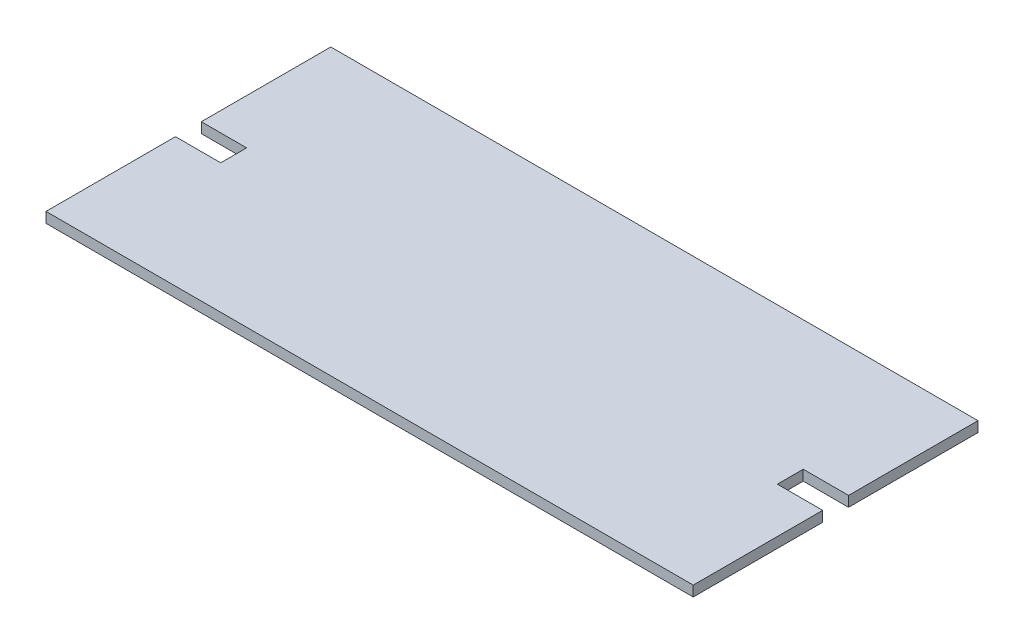
ISO-10303-21;
HEADER;
FILE_DESCRIPTION(('STEP AP214'),'2;1');
FILE_NAME('part.step','',(''),(''),'','','');
FILE_SCHEMA(('AUTOMOTIVE_DESIGN { 1 0 10303 214 1 1 1 1 }'));
ENDSEC;
DATA;
#1=APPLICATION_CONTEXT('core data for automotive mechanical design processes');
#2=APPLICATION_PROTOCOL_DEFINITION('international standard','automotive_design',2000,#1);
#3=PRODUCT_CONTEXT('',#1,'mechanical');
#4=PRODUCT('Part','Part','',(#3));
#5=PRODUCT_RELATED_PRODUCT_CATEGORY('part','',(#4));
#6=PRODUCT_DEFINITION_FORMATION('','',#4);
#7=PRODUCT_DEFINITION_CONTEXT('part definition',#1,'design');
#8=PRODUCT_DEFINITION('design','',#6,#7);
#9=PRODUCT_DEFINITION_SHAPE('','',#8);
#10=(LENGTH_UNIT() NAMED_UNIT(*) SI_UNIT(.MILLI.,.METRE.));
#11=(NAMED_UNIT(*) PLANE_ANGLE_UNIT() SI_UNIT($,.RADIAN.));
#12=(NAMED_UNIT(*) SI_UNIT($,.STERADIAN.) SOLID_ANGLE_UNIT());
#13=UNCERTAINTY_MEASURE_WITH_UNIT(LENGTH_MEASURE(1.E-05),#10,'distance_accuracy_value','');
#14=(GEOMETRIC_REPRESENTATION_CONTEXT(3) GLOBAL_UNCERTAINTY_ASSIGNED_CONTEXT((#13)) GLOBAL_UNIT_ASSIGNED_CONTEXT((#10,
#11,#12)) REPRESENTATION_CONTEXT('',''));
#15=CARTESIAN_POINT('',(0.,0.,0.));
#16=DIRECTION('',(0.,0.,1.));
#17=DIRECTION('',(1.,0.,0.));
#18=AXIS2_PLACEMENT_3D('',#15,#16,#17);
#19=CARTESIAN_POINT('',(43.,1.6,0.));
#20=DIRECTION('',(1.,0.,0.));
#21=DIRECTION('',(0.,0.,-1.));
#22=AXIS2_PLACEMENT_3D('',#19,#20,#21);
#23=PLANE('',#22);
#24=DIRECTION('',(0.,0.,1.));
#25=VECTOR('',#24,1.);
#26=CARTESIAN_POINT('',(43.,0.,0.));
#27=LINE('',#26,#25);
#28=CARTESIAN_POINT('',(43.,0.,-2.));
#29=VERTEX_POINT('',#28);
#30=CARTESIAN_POINT('',(43.,0.,2.));
#31=VERTEX_POINT('',#30);
#32=EDGE_CURVE('E202',#29,#31,#27,.T.);
#33=ORIENTED_EDGE('',*,*,#32,.F.);
#34=DIRECTION('',(0.,-1.,0.));
#35=VECTOR('',#34,1.);
#36=CARTESIAN_POINT('',(43.,1.6,-2.));
#37=LINE('',#36,#35);
#38=CARTESIAN_POINT('',(43.,1.6,-2.));
#39=VERTEX_POINT('',#38);
#40=EDGE_CURVE('E11',#39,#29,#37,.T.);
#41=ORIENTED_EDGE('',*,*,#40,.F.);
#42=DIRECTION('',(0.,0.,1.));
#43=VECTOR('',#42,1.);
#44=CARTESIAN_POINT('',(43.,1.6,0.));
#45=LINE('',#44,#43);
#46=CARTESIAN_POINT('',(43.,1.6,2.));
#47=VERTEX_POINT('',#46);
#48=EDGE_CURVE('E164',#39,#47,#45,.T.);
#49=ORIENTED_EDGE('',*,*,#48,.T.);
#50=DIRECTION('',(0.,-1.,0.));
#51=VECTOR('',#50,1.);
#52=CARTESIAN_POINT('',(43.,1.6,2.));
#53=LINE('',#52,#51);
#54=EDGE_CURVE('E99',#47,#31,#53,.T.);
#55=ORIENTED_EDGE('',*,*,#54,.T.);
#56=EDGE_LOOP('',(#33,#41,#49,#55));
#57=FACE_BOUND('',#56,.T.);
#58=ADVANCED_FACE('F37',(#57),#23,.T.);
#59=CARTESIAN_POINT('',(0.,1.6,-2.00000000000001));
#60=DIRECTION('',(0.,0.,1.));
#61=DIRECTION('',(1.,0.,0.));
#62=AXIS2_PLACEMENT_3D('',#59,#60,#61);
#63=PLANE('',#62);
#64=DIRECTION('',(-1.,0.,0.));
#65=VECTOR('',#64,1.);
#66=CARTESIAN_POINT('',(0.,0.,-2.00000000000001));
#67=LINE('',#66,#65);
#68=CARTESIAN_POINT('',(50.,0.,-2.));
#69=VERTEX_POINT('',#68);
#70=EDGE_CURVE('E199',#69,#29,#67,.T.);
#71=ORIENTED_EDGE('',*,*,#70,.F.);
#72=DIRECTION('',(0.,-1.,0.));
#73=VECTOR('',#72,1.);
#74=CARTESIAN_POINT('',(50.,1.6,-2.));
#75=LINE('',#74,#73);
#76=CARTESIAN_POINT('',(50.,1.6,-2.));
#77=VERTEX_POINT('',#76);
#78=EDGE_CURVE('E45',#77,#69,#75,.T.);
#79=ORIENTED_EDGE('',*,*,#78,.F.);
#80=DIRECTION('',(-1.,0.,0.));
#81=VECTOR('',#80,1.);
#82=CARTESIAN_POINT('',(0.,1.6,-2.00000000000001));
#83=LINE('',#82,#81);
#84=EDGE_CURVE('E158',#77,#39,#83,.T.);
#85=ORIENTED_EDGE('',*,*,#84,.T.);
#86=ORIENTED_EDGE('',*,*,#40,.T.);
#87=EDGE_LOOP('',(#71,#79,#85,#86));
#88=FACE_BOUND('',#87,.T.);
#89=ADVANCED_FACE('F200',(#88),#63,.T.);
#90=CARTESIAN_POINT('',(50.,1.6,0.));
#91=DIRECTION('',(1.,0.,0.));
#92=DIRECTION('',(0.,0.,-1.));
#93=AXIS2_PLACEMENT_3D('',#90,#91,#92);
#94=PLANE('',#93);
#95=DIRECTION('',(0.,0.,1.));
#96=VECTOR('',#95,1.);
#97=CARTESIAN_POINT('',(50.,0.,0.));
#98=LINE('',#97,#96);
#99=CARTESIAN_POINT('',(50.,0.,-22.));
#100=VERTEX_POINT('',#99);
#101=EDGE_CURVE('E173',#100,#69,#98,.T.);
#102=ORIENTED_EDGE('',*,*,#101,.F.);
#103=DIRECTION('',(0.,-1.,0.));
#104=VECTOR('',#103,1.);
#105=CARTESIAN_POINT('',(50.,1.6,-22.));
#106=LINE('',#105,#104);
#107=CARTESIAN_POINT('',(50.,1.6,-22.));
#108=VERTEX_POINT('',#107);
#109=EDGE_CURVE('E192',#108,#100,#106,.T.);
#110=ORIENTED_EDGE('',*,*,#109,.F.);
#111=DIRECTION('',(0.,0.,1.));
#112=VECTOR('',#111,1.);
#113=CARTESIAN_POINT('',(50.,1.6,0.));
#114=LINE('',#113,#112);
#115=EDGE_CURVE('E152',#108,#77,#114,.T.);
#116=ORIENTED_EDGE('',*,*,#115,.T.);
#117=ORIENTED_EDGE('',*,*,#78,.T.);
#118=EDGE_LOOP('',(#102,#110,#116,#117));
#119=FACE_BOUND('',#118,.T.);
#120=ADVANCED_FACE('F195',(#119),#94,.T.);
#121=CARTESIAN_POINT('',(0.,1.6,-22.));
#122=DIRECTION('',(0.,0.,-1.));
#123=DIRECTION('',(-1.,0.,0.));
#124=AXIS2_PLACEMENT_3D('',#121,#122,#123);
#125=PLANE('',#124);
#126=DIRECTION('',(1.,0.,0.));
#127=VECTOR('',#126,1.);
#128=CARTESIAN_POINT('',(0.,0.,-22.));
#129=LINE('',#128,#127);
#130=CARTESIAN_POINT('',(-50.,0.,-22.));
#131=VERTEX_POINT('',#130);
#132=EDGE_CURVE('E207',#131,#100,#129,.T.);
#133=ORIENTED_EDGE('',*,*,#132,.F.);
#134=DIRECTION('',(0.,-1.,0.));
#135=VECTOR('',#134,1.);
#136=CARTESIAN_POINT('',(-50.,1.6,-22.));
#137=LINE('',#136,#135);
#138=CARTESIAN_POINT('',(-50.,1.6,-22.));
#139=VERTEX_POINT('',#138);
#140=EDGE_CURVE('E190',#139,#131,#137,.T.);
#141=ORIENTED_EDGE('',*,*,#140,.F.);
#142=DIRECTION('',(1.,0.,0.));
#143=VECTOR('',#142,1.);
#144=CARTESIAN_POINT('',(0.,1.6,-22.));
#145=LINE('',#144,#143);
#146=EDGE_CURVE('E157',#139,#108,#145,.T.);
#147=ORIENTED_EDGE('',*,*,#146,.T.);
#148=ORIENTED_EDGE('',*,*,#109,.T.);
#149=EDGE_LOOP('',(#133,#141,#147,#148));
#150=FACE_BOUND('',#149,.T.);
#151=ADVANCED_FACE('F250',(#150),#125,.T.);
#152=CARTESIAN_POINT('',(-50.,1.6,0.));
#153=DIRECTION('',(1.,0.,0.));
#154=DIRECTION('',(0.,0.,-1.));
#155=AXIS2_PLACEMENT_3D('',#152,#153,#154);
#156=PLANE('',#155);
#157=DIRECTION('',(0.,0.,1.));
#158=VECTOR('',#157,1.);
#159=CARTESIAN_POINT('',(-50.,0.,0.));
#160=LINE('',#159,#158);
#161=CARTESIAN_POINT('',(-50.,0.,-2.));
#162=VERTEX_POINT('',#161);
#163=EDGE_CURVE('E208',#131,#162,#160,.T.);
#164=ORIENTED_EDGE('',*,*,#163,.T.);
#165=DIRECTION('',(0.,-1.,0.));
#166=VECTOR('',#165,1.);
#167=CARTESIAN_POINT('',(-50.,1.6,-2.));
#168=LINE('',#167,#166);
#169=CARTESIAN_POINT('',(-50.,1.6,-2.));
#170=VERTEX_POINT('',#169);
#171=EDGE_CURVE('E187',#170,#162,#168,.T.);
#172=ORIENTED_EDGE('',*,*,#171,.F.);
#173=DIRECTION('',(0.,0.,1.));
#174=VECTOR('',#173,1.);
#175=CARTESIAN_POINT('',(-50.,1.6,0.));
#176=LINE('',#175,#174);
#177=EDGE_CURVE('E162',#139,#170,#176,.T.);
#178=ORIENTED_EDGE('',*,*,#177,.F.);
#179=ORIENTED_EDGE('',*,*,#140,.T.);
#180=EDGE_LOOP('',(#164,#172,#178,#179));
#181=FACE_BOUND('',#180,.T.);
#182=ADVANCED_FACE('F239',(#181),#156,.F.);
#183=CARTESIAN_POINT('',(0.,1.6,-2.00000000000002));
#184=DIRECTION('',(0.,0.,-1.));
#185=DIRECTION('',(-1.,0.,0.));
#186=AXIS2_PLACEMENT_3D('',#183,#184,#185);
#187=PLANE('',#186);
#188=DIRECTION('',(1.,0.,0.));
#189=VECTOR('',#188,1.);
#190=CARTESIAN_POINT('',(0.,0.,-2.00000000000002));
#191=LINE('',#190,#189);
#192=CARTESIAN_POINT('',(-43.,0.,-2.));
#193=VERTEX_POINT('',#192);
#194=EDGE_CURVE('E213',#162,#193,#191,.T.);
#195=ORIENTED_EDGE('',*,*,#194,.T.);
#196=DIRECTION('',(0.,-1.,0.));
#197=VECTOR('',#196,1.);
#198=CARTESIAN_POINT('',(-43.,1.6,-2.));
#199=LINE('',#198,#197);
#200=CARTESIAN_POINT('',(-43.,1.6,-2.));
#201=VERTEX_POINT('',#200);
#202=EDGE_CURVE('E184',#201,#193,#199,.T.);
#203=ORIENTED_EDGE('',*,*,#202,.F.);
#204=DIRECTION('',(1.,0.,0.));
#205=VECTOR('',#204,1.);
#206=CARTESIAN_POINT('',(0.,1.6,-2.00000000000002));
#207=LINE('',#206,#205);
#208=EDGE_CURVE('E231',#170,#201,#207,.T.);
#209=ORIENTED_EDGE('',*,*,#208,.F.);
#210=ORIENTED_EDGE('',*,*,#171,.T.);
#211=EDGE_LOOP('',(#195,#203,#209,#210));
#212=FACE_BOUND('',#211,.T.);
#213=ADVANCED_FACE('F242',(#212),#187,.F.);
#214=CARTESIAN_POINT('',(-43.,1.6,0.));
#215=DIRECTION('',(1.,0.,0.));
#216=DIRECTION('',(0.,0.,-1.));
#217=AXIS2_PLACEMENT_3D('',#214,#215,#216);
#218=PLANE('',#217);
#219=DIRECTION('',(0.,0.,1.));
#220=VECTOR('',#219,1.);
#221=CARTESIAN_POINT('',(-43.,0.,0.));
#222=LINE('',#221,#220);
#223=CARTESIAN_POINT('',(-43.,0.,2.));
#224=VERTEX_POINT('',#223);
#225=EDGE_CURVE('E216',#193,#224,#222,.T.);
#226=ORIENTED_EDGE('',*,*,#225,.T.);
#227=DIRECTION('',(0.,-1.,0.));
#228=VECTOR('',#227,1.);
#229=CARTESIAN_POINT('',(-43.,1.6,2.));
#230=LINE('',#229,#228);
#231=CARTESIAN_POINT('',(-43.,1.6,2.));
#232=VERTEX_POINT('',#231);
#233=EDGE_CURVE('E182',#232,#224,#230,.T.);
#234=ORIENTED_EDGE('',*,*,#233,.F.);
#235=DIRECTION('',(0.,0.,1.));
#236=VECTOR('',#235,1.);
#237=CARTESIAN_POINT('',(-43.,1.6,0.));
#238=LINE('',#237,#236);
#239=EDGE_CURVE('E229',#201,#232,#238,.T.);
#240=ORIENTED_EDGE('',*,*,#239,.F.);
#241=ORIENTED_EDGE('',*,*,#202,.T.);
#242=EDGE_LOOP('',(#226,#234,#240,#241));
#243=FACE_BOUND('',#242,.T.);
#244=ADVANCED_FACE('F246',(#243),#218,.F.);
#245=CARTESIAN_POINT('',(0.,1.6,2.00000000000002));
#246=DIRECTION('',(0.,0.,-1.));
#247=DIRECTION('',(-1.,0.,0.));
#248=AXIS2_PLACEMENT_3D('',#245,#246,#247);
#249=PLANE('',#248);
#250=DIRECTION('',(1.,0.,0.));
#251=VECTOR('',#250,1.);
#252=CARTESIAN_POINT('',(0.,0.,2.00000000000002));
#253=LINE('',#252,#251);
#254=CARTESIAN_POINT('',(-50.,0.,2.));
#255=VERTEX_POINT('',#254);
#256=EDGE_CURVE('E218',#255,#224,#253,.T.);
#257=ORIENTED_EDGE('',*,*,#256,.F.);
#258=DIRECTION('',(0.,-1.,0.));
#259=VECTOR('',#258,1.);
#260=CARTESIAN_POINT('',(-50.,1.6,2.));
#261=LINE('',#260,#259);
#262=CARTESIAN_POINT('',(-50.,1.6,2.));
#263=VERTEX_POINT('',#262);
#264=EDGE_CURVE('E180',#263,#255,#261,.T.);
#265=ORIENTED_EDGE('',*,*,#264,.F.);
#266=DIRECTION('',(1.,0.,0.));
#267=VECTOR('',#266,1.);
#268=CARTESIAN_POINT('',(0.,1.6,2.00000000000002));
#269=LINE('',#268,#267);
#270=EDGE_CURVE('E226',#263,#232,#269,.T.);
#271=ORIENTED_EDGE('',*,*,#270,.T.);
#272=ORIENTED_EDGE('',*,*,#233,.T.);
#273=EDGE_LOOP('',(#257,#265,#271,#272));
#274=FACE_BOUND('',#273,.T.);
#275=ADVANCED_FACE('F248',(#274),#249,.T.);
#276=CARTESIAN_POINT('',(-50.,0.,22.));
#277=VERTEX_POINT('',#276);
#278=EDGE_CURVE('E214',#255,#277,#160,.T.);
#279=ORIENTED_EDGE('',*,*,#278,.T.);
#280=DIRECTION('',(0.,-1.,0.));
#281=VECTOR('',#280,1.);
#282=CARTESIAN_POINT('',(-50.,1.6,22.));
#283=LINE('',#282,#281);
#284=CARTESIAN_POINT('',(-50.,1.6,22.));
#285=VERTEX_POINT('',#284);
#286=EDGE_CURVE('E148',#285,#277,#283,.T.);
#287=ORIENTED_EDGE('',*,*,#286,.F.);
#288=EDGE_CURVE('E135',#263,#285,#176,.T.);
#289=ORIENTED_EDGE('',*,*,#288,.F.);
#290=ORIENTED_EDGE('',*,*,#264,.T.);
#291=EDGE_LOOP('',(#279,#287,#289,#290));
#292=FACE_BOUND('',#291,.T.);
#293=ADVANCED_FACE('F224',(#292),#156,.F.);
#294=CARTESIAN_POINT('',(0.,1.6,22.));
#295=DIRECTION('',(0.,0.,-1.));
#296=DIRECTION('',(-1.,0.,0.));
#297=AXIS2_PLACEMENT_3D('',#294,#295,#296);
#298=PLANE('',#297);
#299=DIRECTION('',(1.,0.,0.));
#300=VECTOR('',#299,1.);
#301=CARTESIAN_POINT('',(0.,0.,22.));
#302=LINE('',#301,#300);
#303=CARTESIAN_POINT('',(50.,0.,22.));
#304=VERTEX_POINT('',#303);
#305=EDGE_CURVE('E144',#277,#304,#302,.T.);
#306=ORIENTED_EDGE('',*,*,#305,.T.);
#307=DIRECTION('',(0.,-1.,0.));
#308=VECTOR('',#307,1.);
#309=CARTESIAN_POINT('',(50.,1.6,22.));
#310=LINE('',#309,#308);
#311=CARTESIAN_POINT('',(50.,1.6,22.));
#312=VERTEX_POINT('',#311);
#313=EDGE_CURVE('E141',#312,#304,#310,.T.);
#314=ORIENTED_EDGE('',*,*,#313,.F.);
#315=DIRECTION('',(1.,0.,0.));
#316=VECTOR('',#315,1.);
#317=CARTESIAN_POINT('',(0.,1.6,22.));
#318=LINE('',#317,#316);
#319=EDGE_CURVE('E128',#285,#312,#318,.T.);
#320=ORIENTED_EDGE('',*,*,#319,.F.);
#321=ORIENTED_EDGE('',*,*,#286,.T.);
#322=EDGE_LOOP('',(#306,#314,#320,#321));
#323=FACE_BOUND('',#322,.T.);
#324=ADVANCED_FACE('F142',(#323),#298,.F.);
#325=CARTESIAN_POINT('',(50.,0.,2.));
#326=VERTEX_POINT('',#325);
#327=EDGE_CURVE('E169',#326,#304,#98,.T.);
#328=ORIENTED_EDGE('',*,*,#327,.F.);
#329=DIRECTION('',(0.,-1.,0.));
#330=VECTOR('',#329,1.);
#331=CARTESIAN_POINT('',(50.,1.6,2.));
#332=LINE('',#331,#330);
#333=CARTESIAN_POINT('',(50.,1.6,2.));
#334=VERTEX_POINT('',#333);
#335=EDGE_CURVE('E92',#334,#326,#332,.T.);
#336=ORIENTED_EDGE('',*,*,#335,.F.);
#337=EDGE_CURVE('E132',#334,#312,#114,.T.);
#338=ORIENTED_EDGE('',*,*,#337,.T.);
#339=ORIENTED_EDGE('',*,*,#313,.T.);
#340=EDGE_LOOP('',(#328,#336,#338,#339));
#341=FACE_BOUND('',#340,.T.);
#342=ADVANCED_FACE('F150',(#341),#94,.T.);
#343=CARTESIAN_POINT('',(0.,1.6,2.00000000000001));
#344=DIRECTION('',(0.,0.,1.));
#345=DIRECTION('',(1.,0.,0.));
#346=AXIS2_PLACEMENT_3D('',#343,#344,#345);
#347=PLANE('',#346);
#348=DIRECTION('',(-1.,0.,0.));
#349=VECTOR('',#348,1.);
#350=CARTESIAN_POINT('',(0.,0.,2.00000000000001));
#351=LINE('',#350,#349);
#352=EDGE_CURVE('E167',#326,#31,#351,.T.);
#353=ORIENTED_EDGE('',*,*,#352,.T.);
#354=ORIENTED_EDGE('',*,*,#54,.F.);
#355=DIRECTION('',(-1.,0.,0.));
#356=VECTOR('',#355,1.);
#357=CARTESIAN_POINT('',(0.,1.6,2.00000000000001));
#358=LINE('',#357,#356);
#359=EDGE_CURVE('E53',#334,#47,#358,.T.);
#360=ORIENTED_EDGE('',*,*,#359,.F.);
#361=ORIENTED_EDGE('',*,*,#335,.T.);
#362=EDGE_LOOP('',(#353,#354,#360,#361));
#363=FACE_BOUND('',#362,.T.);
#364=ADVANCED_FACE('F327',(#363),#347,.F.);
#365=CARTESIAN_POINT('',(0.,1.6,0.));
#366=DIRECTION('',(0.,1.,0.));
#367=DIRECTION('',(0.,0.,1.));
#368=AXIS2_PLACEMENT_3D('',#365,#366,#367);
#369=PLANE('',#368);
#370=ORIENTED_EDGE('',*,*,#48,.F.);
#371=ORIENTED_EDGE('',*,*,#84,.F.);
#372=ORIENTED_EDGE('',*,*,#115,.F.);
#373=ORIENTED_EDGE('',*,*,#146,.F.);
#374=ORIENTED_EDGE('',*,*,#177,.T.);
#375=ORIENTED_EDGE('',*,*,#208,.T.);
#376=ORIENTED_EDGE('',*,*,#239,.T.);
#377=ORIENTED_EDGE('',*,*,#270,.F.);
#378=ORIENTED_EDGE('',*,*,#288,.T.);
#379=ORIENTED_EDGE('',*,*,#319,.T.);
#380=ORIENTED_EDGE('',*,*,#337,.F.);
#381=ORIENTED_EDGE('',*,*,#359,.T.);
#382=EDGE_LOOP('',(#370,#371,#372,#373,#374,#375,#376,#377,#378,#379,#380,#381));
#383=FACE_BOUND('',#382,.T.);
#384=ADVANCED_FACE('F130',(#383),#369,.T.);
#385=CARTESIAN_POINT('',(0.,0.,0.));
#386=DIRECTION('',(0.,1.,0.));
#387=DIRECTION('',(0.,0.,1.));
#388=AXIS2_PLACEMENT_3D('',#385,#386,#387);
#389=PLANE('',#388);
#390=ORIENTED_EDGE('',*,*,#32,.T.);
#391=ORIENTED_EDGE('',*,*,#352,.F.);
#392=ORIENTED_EDGE('',*,*,#327,.T.);
#393=ORIENTED_EDGE('',*,*,#305,.F.);
#394=ORIENTED_EDGE('',*,*,#278,.F.);
#395=ORIENTED_EDGE('',*,*,#256,.T.);
#396=ORIENTED_EDGE('',*,*,#225,.F.);
#397=ORIENTED_EDGE('',*,*,#194,.F.);
#398=ORIENTED_EDGE('',*,*,#163,.F.);
#399=ORIENTED_EDGE('',*,*,#132,.T.);
#400=ORIENTED_EDGE('',*,*,#101,.T.);
#401=ORIENTED_EDGE('',*,*,#70,.T.);
#402=EDGE_LOOP('',(#390,#391,#392,#393,#394,#395,#396,#397,#398,#399,#400,#401));
#403=FACE_BOUND('',#402,.T.);
#404=ADVANCED_FACE('F204',(#403),#389,.F.);
#405=CLOSED_SHELL('',(#58,#89,#120,#151,#182,#213,#244,#275,#293,#324,#342,#364,#384,#404));
#406=MANIFOLD_SOLID_BREP('B2',#405);
#407=ADVANCED_BREP_SHAPE_REPRESENTATION('',(#18,#406),#14);
#408=SHAPE_DEFINITION_REPRESENTATION(#9,#407);
ENDSEC;
END-ISO-10303-21;
